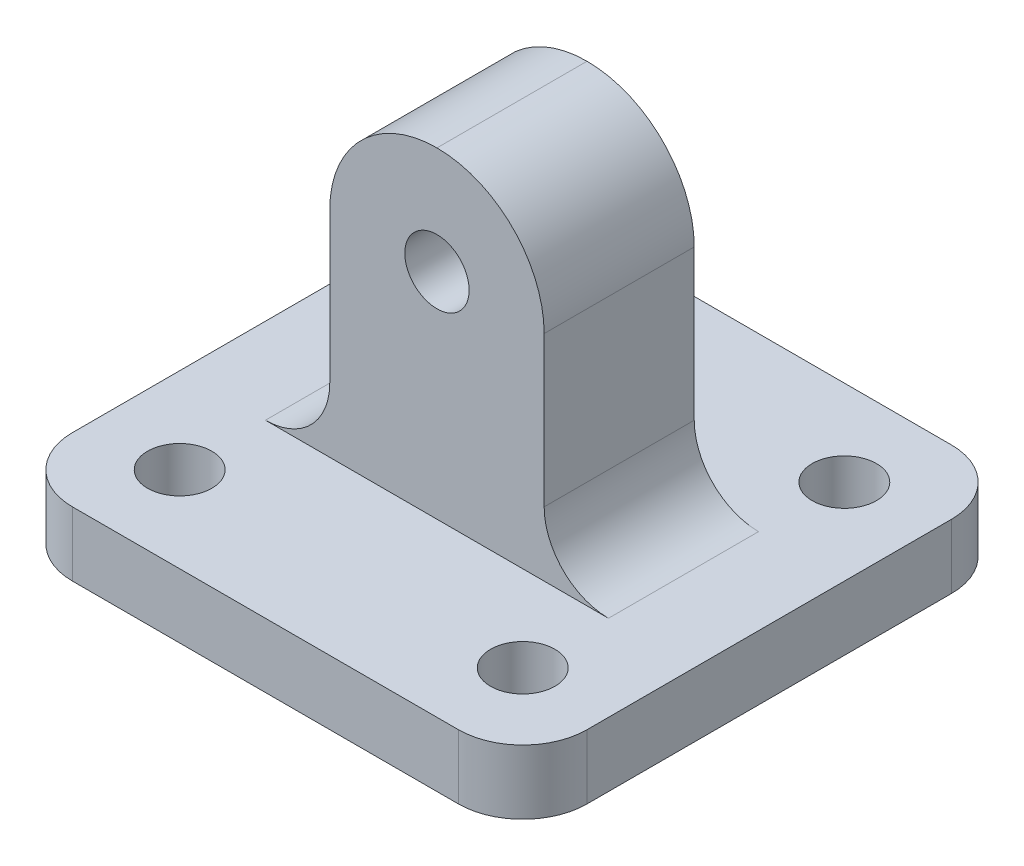
ISO-10303-21;
HEADER;
FILE_DESCRIPTION(('STEP AP214'),'2;1');
FILE_NAME('part.step','',(''),(''),'','','');
FILE_SCHEMA(('AUTOMOTIVE_DESIGN { 1 0 10303 214 1 1 1 1 }'));
ENDSEC;
DATA;
#1=APPLICATION_CONTEXT('core data for automotive mechanical design processes');
#2=APPLICATION_PROTOCOL_DEFINITION('international standard','automotive_design',2000,#1);
#3=PRODUCT_CONTEXT('',#1,'mechanical');
#4=PRODUCT('Part','Part','',(#3));
#5=PRODUCT_RELATED_PRODUCT_CATEGORY('part','',(#4));
#6=PRODUCT_DEFINITION_FORMATION('','',#4);
#7=PRODUCT_DEFINITION_CONTEXT('part definition',#1,'design');
#8=PRODUCT_DEFINITION('design','',#6,#7);
#9=PRODUCT_DEFINITION_SHAPE('','',#8);
#10=(LENGTH_UNIT() NAMED_UNIT(*) SI_UNIT(.MILLI.,.METRE.));
#11=(NAMED_UNIT(*) PLANE_ANGLE_UNIT() SI_UNIT($,.RADIAN.));
#12=(NAMED_UNIT(*) SI_UNIT($,.STERADIAN.) SOLID_ANGLE_UNIT());
#13=UNCERTAINTY_MEASURE_WITH_UNIT(LENGTH_MEASURE(1.E-05),#10,'distance_accuracy_value','');
#14=(GEOMETRIC_REPRESENTATION_CONTEXT(3) GLOBAL_UNCERTAINTY_ASSIGNED_CONTEXT((#13)) GLOBAL_UNIT_ASSIGNED_CONTEXT((#10,
#11,#12)) REPRESENTATION_CONTEXT('',''));
#15=CARTESIAN_POINT('',(0.,0.,0.));
#16=DIRECTION('',(0.,0.,1.));
#17=DIRECTION('',(1.,0.,0.));
#18=AXIS2_PLACEMENT_3D('',#15,#16,#17);
#19=CARTESIAN_POINT('',(0.,3.,0.));
#20=DIRECTION('',(0.,-1.,0.));
#21=DIRECTION('',(0.,0.,-1.));
#22=AXIS2_PLACEMENT_3D('',#19,#20,#21);
#23=PLANE('',#22);
#24=CARTESIAN_POINT('',(8.,3.,-7.5));
#25=DIRECTION('',(0.,1.,0.));
#26=DIRECTION('',(0.,0.,1.));
#27=AXIS2_PLACEMENT_3D('',#24,#25,#26);
#28=CIRCLE('',#27,1.5);
#29=CARTESIAN_POINT('',(8.,3.,-6.));
#30=VERTEX_POINT('',#29);
#31=EDGE_CURVE('E187',#30,#30,#28,.T.);
#32=ORIENTED_EDGE('',*,*,#31,.F.);
#33=EDGE_LOOP('',(#32));
#34=FACE_BOUND('',#33,.T.);
#35=CARTESIAN_POINT('',(8.,3.,7.5));
#36=DIRECTION('',(0.,1.,0.));
#37=DIRECTION('',(0.,0.,1.));
#38=AXIS2_PLACEMENT_3D('',#35,#36,#37);
#39=CIRCLE('',#38,1.5);
#40=CARTESIAN_POINT('',(8.,3.,9.));
#41=VERTEX_POINT('',#40);
#42=EDGE_CURVE('E291',#41,#41,#39,.T.);
#43=ORIENTED_EDGE('',*,*,#42,.F.);
#44=EDGE_LOOP('',(#43));
#45=FACE_BOUND('',#44,.T.);
#46=CARTESIAN_POINT('',(-8.,3.,7.5));
#47=DIRECTION('',(0.,1.,0.));
#48=DIRECTION('',(0.,0.,1.));
#49=AXIS2_PLACEMENT_3D('',#46,#47,#48);
#50=CIRCLE('',#49,1.5);
#51=CARTESIAN_POINT('',(-8.,3.,9.));
#52=VERTEX_POINT('',#51);
#53=EDGE_CURVE('E297',#52,#52,#50,.T.);
#54=ORIENTED_EDGE('',*,*,#53,.F.);
#55=EDGE_LOOP('',(#54));
#56=FACE_BOUND('',#55,.T.);
#57=CARTESIAN_POINT('',(-8.,3.,-7.5));
#58=DIRECTION('',(0.,1.,0.));
#59=DIRECTION('',(0.,0.,1.));
#60=AXIS2_PLACEMENT_3D('',#57,#58,#59);
#61=CIRCLE('',#60,1.5);
#62=CARTESIAN_POINT('',(-8.,3.,-6.));
#63=VERTEX_POINT('',#62);
#64=EDGE_CURVE('E280',#63,#63,#61,.T.);
#65=ORIENTED_EDGE('',*,*,#64,.F.);
#66=EDGE_LOOP('',(#65));
#67=FACE_BOUND('',#66,.T.);
#68=DIRECTION('',(0.,0.,-1.));
#69=VECTOR('',#68,1.);
#70=CARTESIAN_POINT('',(12.,3.,11.5));
#71=LINE('',#70,#69);
#72=CARTESIAN_POINT('',(12.,3.,8.5));
#73=VERTEX_POINT('',#72);
#74=CARTESIAN_POINT('',(12.,3.,-8.5));
#75=VERTEX_POINT('',#74);
#76=EDGE_CURVE('E252',#73,#75,#71,.T.);
#77=ORIENTED_EDGE('',*,*,#76,.T.);
#78=CARTESIAN_POINT('',(9.,3.,-8.5));
#79=DIRECTION('',(0.,-1.,0.));
#80=DIRECTION('',(0.,0.,-1.));
#81=AXIS2_PLACEMENT_3D('',#78,#79,#80);
#82=CIRCLE('',#81,3.);
#83=CARTESIAN_POINT('',(9.,3.,-11.5));
#84=VERTEX_POINT('',#83);
#85=EDGE_CURVE('E230',#75,#84,#82,.F.);
#86=ORIENTED_EDGE('',*,*,#85,.T.);
#87=DIRECTION('',(-1.,0.,0.));
#88=VECTOR('',#87,1.);
#89=CARTESIAN_POINT('',(-12.,3.,-11.5));
#90=LINE('',#89,#88);
#91=CARTESIAN_POINT('',(-9.,3.,-11.5));
#92=VERTEX_POINT('',#91);
#93=EDGE_CURVE('E259',#84,#92,#90,.T.);
#94=ORIENTED_EDGE('',*,*,#93,.T.);
#95=CARTESIAN_POINT('',(-9.,3.,-8.5));
#96=DIRECTION('',(0.,-1.,0.));
#97=DIRECTION('',(0.,0.,-1.));
#98=AXIS2_PLACEMENT_3D('',#95,#96,#97);
#99=CIRCLE('',#98,3.);
#100=CARTESIAN_POINT('',(-12.,3.,-8.5));
#101=VERTEX_POINT('',#100);
#102=EDGE_CURVE('E225',#92,#101,#99,.F.);
#103=ORIENTED_EDGE('',*,*,#102,.T.);
#104=DIRECTION('',(0.,0.,1.));
#105=VECTOR('',#104,1.);
#106=CARTESIAN_POINT('',(-12.,3.,11.5));
#107=LINE('',#106,#105);
#108=CARTESIAN_POINT('',(-12.,3.,8.5));
#109=VERTEX_POINT('',#108);
#110=EDGE_CURVE('E175',#101,#109,#107,.T.);
#111=ORIENTED_EDGE('',*,*,#110,.T.);
#112=CARTESIAN_POINT('',(-9.,3.,8.5));
#113=DIRECTION('',(0.,-1.,0.));
#114=DIRECTION('',(0.,0.,-1.));
#115=AXIS2_PLACEMENT_3D('',#112,#113,#114);
#116=CIRCLE('',#115,3.);
#117=CARTESIAN_POINT('',(-9.,3.,11.5));
#118=VERTEX_POINT('',#117);
#119=EDGE_CURVE('E56',#109,#118,#116,.F.);
#120=ORIENTED_EDGE('',*,*,#119,.T.);
#121=DIRECTION('',(1.,0.,0.));
#122=VECTOR('',#121,1.);
#123=CARTESIAN_POINT('',(-12.,3.,11.5));
#124=LINE('',#123,#122);
#125=CARTESIAN_POINT('',(9.,3.,11.5));
#126=VERTEX_POINT('',#125);
#127=EDGE_CURVE('E171',#118,#126,#124,.T.);
#128=ORIENTED_EDGE('',*,*,#127,.T.);
#129=CARTESIAN_POINT('',(9.,3.,8.5));
#130=DIRECTION('',(0.,-1.,0.));
#131=DIRECTION('',(0.,0.,-1.));
#132=AXIS2_PLACEMENT_3D('',#129,#130,#131);
#133=CIRCLE('',#132,3.);
#134=EDGE_CURVE('E228',#126,#73,#133,.F.);
#135=ORIENTED_EDGE('',*,*,#134,.T.);
#136=EDGE_LOOP('',(#77,#86,#94,#103,#111,#120,#128,#135));
#137=FACE_BOUND('',#136,.T.);
#138=DIRECTION('',(-1.,0.,0.));
#139=VECTOR('',#138,1.);
#140=CARTESIAN_POINT('',(-5.,3.,-3.5));
#141=LINE('',#140,#139);
#142=CARTESIAN_POINT('',(8.,3.,-3.5));
#143=VERTEX_POINT('',#142);
#144=CARTESIAN_POINT('',(-8.,3.,-3.5));
#145=VERTEX_POINT('',#144);
#146=EDGE_CURVE('E271',#143,#145,#141,.T.);
#147=ORIENTED_EDGE('',*,*,#146,.F.);
#148=DIRECTION('',(0.,0.,-1.));
#149=VECTOR('',#148,1.);
#150=CARTESIAN_POINT('',(8.,3.,3.5));
#151=LINE('',#150,#149);
#152=CARTESIAN_POINT('',(8.,3.,3.5));
#153=VERTEX_POINT('',#152);
#154=EDGE_CURVE('E192',#143,#153,#151,.F.);
#155=ORIENTED_EDGE('',*,*,#154,.T.);
#156=DIRECTION('',(1.,0.,0.));
#157=VECTOR('',#156,1.);
#158=CARTESIAN_POINT('',(-5.,3.,3.5));
#159=LINE('',#158,#157);
#160=CARTESIAN_POINT('',(-8.,3.,3.5));
#161=VERTEX_POINT('',#160);
#162=EDGE_CURVE('E164',#161,#153,#159,.T.);
#163=ORIENTED_EDGE('',*,*,#162,.F.);
#164=DIRECTION('',(0.,0.,1.));
#165=VECTOR('',#164,1.);
#166=CARTESIAN_POINT('',(-8.,3.,-3.5));
#167=LINE('',#166,#165);
#168=EDGE_CURVE('E189',#161,#145,#167,.F.);
#169=ORIENTED_EDGE('',*,*,#168,.T.);
#170=EDGE_LOOP('',(#147,#155,#163,#169));
#171=FACE_BOUND('',#170,.T.);
#172=ADVANCED_FACE('F34',(#34,#45,#56,#67,#137,#171),#23,.F.);
#173=CARTESIAN_POINT('',(12.,3.,11.5));
#174=DIRECTION('',(-1.,0.,0.));
#175=DIRECTION('',(0.,0.,1.));
#176=AXIS2_PLACEMENT_3D('',#173,#174,#175);
#177=PLANE('',#176);
#178=DIRECTION('',(0.,0.,-1.));
#179=VECTOR('',#178,1.);
#180=CARTESIAN_POINT('',(12.,0.,11.5));
#181=LINE('',#180,#179);
#182=CARTESIAN_POINT('',(12.,0.,8.5));
#183=VERTEX_POINT('',#182);
#184=CARTESIAN_POINT('',(12.,0.,-8.5));
#185=VERTEX_POINT('',#184);
#186=EDGE_CURVE('E253',#183,#185,#181,.T.);
#187=ORIENTED_EDGE('',*,*,#186,.T.);
#188=DIRECTION('',(0.,-1.,0.));
#189=VECTOR('',#188,1.);
#190=CARTESIAN_POINT('',(12.,3.,-8.5));
#191=LINE('',#190,#189);
#192=EDGE_CURVE('E223',#185,#75,#191,.F.);
#193=ORIENTED_EDGE('',*,*,#192,.T.);
#194=ORIENTED_EDGE('',*,*,#76,.F.);
#195=DIRECTION('',(0.,-1.,0.));
#196=VECTOR('',#195,1.);
#197=CARTESIAN_POINT('',(12.,3.,8.5));
#198=LINE('',#197,#196);
#199=EDGE_CURVE('E220',#73,#183,#198,.T.);
#200=ORIENTED_EDGE('',*,*,#199,.T.);
#201=EDGE_LOOP('',(#187,#193,#194,#200));
#202=FACE_BOUND('',#201,.T.);
#203=ADVANCED_FACE('F315',(#202),#177,.F.);
#204=CARTESIAN_POINT('',(-12.,3.,-11.5));
#205=DIRECTION('',(0.,0.,1.));
#206=DIRECTION('',(1.,0.,0.));
#207=AXIS2_PLACEMENT_3D('',#204,#205,#206);
#208=PLANE('',#207);
#209=ORIENTED_EDGE('',*,*,#93,.F.);
#210=DIRECTION('',(0.,-1.,0.));
#211=VECTOR('',#210,1.);
#212=CARTESIAN_POINT('',(9.,3.,-11.5));
#213=LINE('',#212,#211);
#214=CARTESIAN_POINT('',(9.,0.,-11.5));
#215=VERTEX_POINT('',#214);
#216=EDGE_CURVE('E209',#84,#215,#213,.T.);
#217=ORIENTED_EDGE('',*,*,#216,.T.);
#218=DIRECTION('',(-1.,0.,0.));
#219=VECTOR('',#218,1.);
#220=CARTESIAN_POINT('',(-12.,0.,-11.5));
#221=LINE('',#220,#219);
#222=CARTESIAN_POINT('',(-9.,0.,-11.5));
#223=VERTEX_POINT('',#222);
#224=EDGE_CURVE('E251',#215,#223,#221,.T.);
#225=ORIENTED_EDGE('',*,*,#224,.T.);
#226=DIRECTION('',(0.,-1.,0.));
#227=VECTOR('',#226,1.);
#228=CARTESIAN_POINT('',(-9.,3.,-11.5));
#229=LINE('',#228,#227);
#230=EDGE_CURVE('E207',#223,#92,#229,.F.);
#231=ORIENTED_EDGE('',*,*,#230,.T.);
#232=EDGE_LOOP('',(#209,#217,#225,#231));
#233=FACE_BOUND('',#232,.T.);
#234=ADVANCED_FACE('F367',(#233),#208,.F.);
#235=CARTESIAN_POINT('',(-12.,3.,11.5));
#236=DIRECTION('',(1.,0.,0.));
#237=DIRECTION('',(0.,0.,-1.));
#238=AXIS2_PLACEMENT_3D('',#235,#236,#237);
#239=PLANE('',#238);
#240=DIRECTION('',(0.,0.,1.));
#241=VECTOR('',#240,1.);
#242=CARTESIAN_POINT('',(-12.,0.,11.5));
#243=LINE('',#242,#241);
#244=CARTESIAN_POINT('',(-12.,0.,-8.5));
#245=VERTEX_POINT('',#244);
#246=CARTESIAN_POINT('',(-12.,0.,8.5));
#247=VERTEX_POINT('',#246);
#248=EDGE_CURVE('E242',#245,#247,#243,.T.);
#249=ORIENTED_EDGE('',*,*,#248,.T.);
#250=DIRECTION('',(0.,-1.,0.));
#251=VECTOR('',#250,1.);
#252=CARTESIAN_POINT('',(-12.,3.,8.5));
#253=LINE('',#252,#251);
#254=EDGE_CURVE('E11',#247,#109,#253,.F.);
#255=ORIENTED_EDGE('',*,*,#254,.T.);
#256=ORIENTED_EDGE('',*,*,#110,.F.);
#257=DIRECTION('',(0.,-1.,0.));
#258=VECTOR('',#257,1.);
#259=CARTESIAN_POINT('',(-12.,3.,-8.5));
#260=LINE('',#259,#258);
#261=EDGE_CURVE('E42',#101,#245,#260,.T.);
#262=ORIENTED_EDGE('',*,*,#261,.T.);
#263=EDGE_LOOP('',(#249,#255,#256,#262));
#264=FACE_BOUND('',#263,.T.);
#265=ADVANCED_FACE('F241',(#264),#239,.F.);
#266=CARTESIAN_POINT('',(-12.,3.,11.5));
#267=DIRECTION('',(0.,0.,-1.));
#268=DIRECTION('',(-1.,0.,0.));
#269=AXIS2_PLACEMENT_3D('',#266,#267,#268);
#270=PLANE('',#269);
#271=DIRECTION('',(1.,0.,0.));
#272=VECTOR('',#271,1.);
#273=CARTESIAN_POINT('',(-12.,0.,11.5));
#274=LINE('',#273,#272);
#275=CARTESIAN_POINT('',(-9.,0.,11.5));
#276=VERTEX_POINT('',#275);
#277=CARTESIAN_POINT('',(9.,0.,11.5));
#278=VERTEX_POINT('',#277);
#279=EDGE_CURVE('E178',#276,#278,#274,.T.);
#280=ORIENTED_EDGE('',*,*,#279,.T.);
#281=DIRECTION('',(0.,-1.,0.));
#282=VECTOR('',#281,1.);
#283=CARTESIAN_POINT('',(9.,3.,11.5));
#284=LINE('',#283,#282);
#285=EDGE_CURVE('E49',#278,#126,#284,.F.);
#286=ORIENTED_EDGE('',*,*,#285,.T.);
#287=ORIENTED_EDGE('',*,*,#127,.F.);
#288=DIRECTION('',(0.,-1.,0.));
#289=VECTOR('',#288,1.);
#290=CARTESIAN_POINT('',(-9.,3.,11.5));
#291=LINE('',#290,#289);
#292=EDGE_CURVE('E232',#118,#276,#291,.T.);
#293=ORIENTED_EDGE('',*,*,#292,.T.);
#294=EDGE_LOOP('',(#280,#286,#287,#293));
#295=FACE_BOUND('',#294,.T.);
#296=ADVANCED_FACE('F358',(#295),#270,.F.);
#297=CARTESIAN_POINT('',(0.,0.,0.));
#298=DIRECTION('',(0.,-1.,0.));
#299=DIRECTION('',(0.,0.,-1.));
#300=AXIS2_PLACEMENT_3D('',#297,#298,#299);
#301=PLANE('',#300);
#302=CARTESIAN_POINT('',(8.,0.,-7.5));
#303=DIRECTION('',(0.,1.,0.));
#304=DIRECTION('',(0.,0.,1.));
#305=AXIS2_PLACEMENT_3D('',#302,#303,#304);
#306=CIRCLE('',#305,1.5);
#307=CARTESIAN_POINT('',(8.,0.,-6.));
#308=VERTEX_POINT('',#307);
#309=EDGE_CURVE('E288',#308,#308,#306,.T.);
#310=ORIENTED_EDGE('',*,*,#309,.T.);
#311=EDGE_LOOP('',(#310));
#312=FACE_BOUND('',#311,.T.);
#313=CARTESIAN_POINT('',(8.,0.,7.5));
#314=DIRECTION('',(0.,1.,0.));
#315=DIRECTION('',(0.,0.,1.));
#316=AXIS2_PLACEMENT_3D('',#313,#314,#315);
#317=CIRCLE('',#316,1.5);
#318=CARTESIAN_POINT('',(8.,0.,9.));
#319=VERTEX_POINT('',#318);
#320=EDGE_CURVE('E294',#319,#319,#317,.T.);
#321=ORIENTED_EDGE('',*,*,#320,.T.);
#322=EDGE_LOOP('',(#321));
#323=FACE_BOUND('',#322,.T.);
#324=CARTESIAN_POINT('',(-8.,0.,7.5));
#325=DIRECTION('',(0.,1.,0.));
#326=DIRECTION('',(0.,0.,1.));
#327=AXIS2_PLACEMENT_3D('',#324,#325,#326);
#328=CIRCLE('',#327,1.5);
#329=CARTESIAN_POINT('',(-8.,0.,9.));
#330=VERTEX_POINT('',#329);
#331=EDGE_CURVE('E283',#330,#330,#328,.T.);
#332=ORIENTED_EDGE('',*,*,#331,.T.);
#333=EDGE_LOOP('',(#332));
#334=FACE_BOUND('',#333,.T.);
#335=CARTESIAN_POINT('',(-8.,0.,-7.5));
#336=DIRECTION('',(0.,1.,0.));
#337=DIRECTION('',(0.,0.,1.));
#338=AXIS2_PLACEMENT_3D('',#335,#336,#337);
#339=CIRCLE('',#338,1.5);
#340=CARTESIAN_POINT('',(-8.,0.,-6.));
#341=VERTEX_POINT('',#340);
#342=EDGE_CURVE('E279',#341,#341,#339,.T.);
#343=ORIENTED_EDGE('',*,*,#342,.T.);
#344=EDGE_LOOP('',(#343));
#345=FACE_BOUND('',#344,.T.);
#346=ORIENTED_EDGE('',*,*,#224,.F.);
#347=CARTESIAN_POINT('',(9.,0.,-8.5));
#348=DIRECTION('',(0.,-1.,0.));
#349=DIRECTION('',(0.,0.,-1.));
#350=AXIS2_PLACEMENT_3D('',#347,#348,#349);
#351=CIRCLE('',#350,3.);
#352=EDGE_CURVE('E218',#215,#185,#351,.T.);
#353=ORIENTED_EDGE('',*,*,#352,.T.);
#354=ORIENTED_EDGE('',*,*,#186,.F.);
#355=CARTESIAN_POINT('',(9.,0.,8.5));
#356=DIRECTION('',(0.,-1.,0.));
#357=DIRECTION('',(0.,0.,-1.));
#358=AXIS2_PLACEMENT_3D('',#355,#356,#357);
#359=CIRCLE('',#358,3.);
#360=EDGE_CURVE('E216',#183,#278,#359,.T.);
#361=ORIENTED_EDGE('',*,*,#360,.T.);
#362=ORIENTED_EDGE('',*,*,#279,.F.);
#363=CARTESIAN_POINT('',(-9.,0.,8.5));
#364=DIRECTION('',(0.,-1.,0.));
#365=DIRECTION('',(0.,0.,-1.));
#366=AXIS2_PLACEMENT_3D('',#363,#364,#365);
#367=CIRCLE('',#366,3.);
#368=EDGE_CURVE('E214',#276,#247,#367,.T.);
#369=ORIENTED_EDGE('',*,*,#368,.T.);
#370=ORIENTED_EDGE('',*,*,#248,.F.);
#371=CARTESIAN_POINT('',(-9.,0.,-8.5));
#372=DIRECTION('',(0.,-1.,0.));
#373=DIRECTION('',(0.,0.,-1.));
#374=AXIS2_PLACEMENT_3D('',#371,#372,#373);
#375=CIRCLE('',#374,3.);
#376=EDGE_CURVE('E212',#245,#223,#375,.T.);
#377=ORIENTED_EDGE('',*,*,#376,.T.);
#378=EDGE_LOOP('',(#346,#353,#354,#361,#362,#369,#370,#377));
#379=FACE_BOUND('',#378,.T.);
#380=ADVANCED_FACE('F248',(#312,#323,#334,#345,#379),#301,.T.);
#381=CARTESIAN_POINT('',(5.,18.,3.5));
#382=DIRECTION('',(-1.,0.,0.));
#383=DIRECTION('',(0.,0.,1.));
#384=AXIS2_PLACEMENT_3D('',#381,#382,#383);
#385=PLANE('',#384);
#386=DIRECTION('',(0.,-1.,0.));
#387=VECTOR('',#386,1.);
#388=CARTESIAN_POINT('',(5.,18.,3.5));
#389=LINE('',#388,#387);
#390=CARTESIAN_POINT('',(5.,13.,3.5));
#391=VERTEX_POINT('',#390);
#392=CARTESIAN_POINT('',(5.,6.,3.5));
#393=VERTEX_POINT('',#392);
#394=EDGE_CURVE('E147',#391,#393,#389,.T.);
#395=ORIENTED_EDGE('',*,*,#394,.T.);
#396=DIRECTION('',(0.,0.,-1.));
#397=VECTOR('',#396,1.);
#398=CARTESIAN_POINT('',(5.,6.,-3.5));
#399=LINE('',#398,#397);
#400=CARTESIAN_POINT('',(5.,6.,-3.5));
#401=VERTEX_POINT('',#400);
#402=EDGE_CURVE('E154',#393,#401,#399,.T.);
#403=ORIENTED_EDGE('',*,*,#402,.T.);
#404=DIRECTION('',(0.,-1.,0.));
#405=VECTOR('',#404,1.);
#406=CARTESIAN_POINT('',(5.,18.,-3.5));
#407=LINE('',#406,#405);
#408=CARTESIAN_POINT('',(5.,13.,-3.5));
#409=VERTEX_POINT('',#408);
#410=EDGE_CURVE('E150',#409,#401,#407,.T.);
#411=ORIENTED_EDGE('',*,*,#410,.F.);
#412=DIRECTION('',(0.,0.,-1.));
#413=VECTOR('',#412,1.);
#414=CARTESIAN_POINT('',(5.,13.,3.5));
#415=LINE('',#414,#413);
#416=EDGE_CURVE('E143',#409,#391,#415,.F.);
#417=ORIENTED_EDGE('',*,*,#416,.T.);
#418=EDGE_LOOP('',(#395,#403,#411,#417));
#419=FACE_BOUND('',#418,.T.);
#420=ADVANCED_FACE('F145',(#419),#385,.F.);
#421=CARTESIAN_POINT('',(-5.,18.,-3.5));
#422=DIRECTION('',(0.,0.,1.));
#423=DIRECTION('',(1.,0.,0.));
#424=AXIS2_PLACEMENT_3D('',#421,#422,#423);
#425=PLANE('',#424);
#426=CARTESIAN_POINT('',(0.,13.,-3.5));
#427=DIRECTION('',(0.,0.,1.));
#428=DIRECTION('',(1.,0.,0.));
#429=AXIS2_PLACEMENT_3D('',#426,#427,#428);
#430=CIRCLE('',#429,1.5);
#431=CARTESIAN_POINT('',(1.5,13.,-3.5));
#432=VERTEX_POINT('',#431);
#433=EDGE_CURVE('E273',#432,#432,#430,.T.);
#434=ORIENTED_EDGE('',*,*,#433,.T.);
#435=EDGE_LOOP('',(#434));
#436=FACE_BOUND('',#435,.T.);
#437=DIRECTION('',(0.,-1.,0.));
#438=VECTOR('',#437,1.);
#439=CARTESIAN_POINT('',(-5.,18.,-3.5));
#440=LINE('',#439,#438);
#441=CARTESIAN_POINT('',(-5.,13.,-3.5));
#442=VERTEX_POINT('',#441);
#443=CARTESIAN_POINT('',(-5.,6.,-3.5));
#444=VERTEX_POINT('',#443);
#445=EDGE_CURVE('E265',#442,#444,#440,.T.);
#446=ORIENTED_EDGE('',*,*,#445,.F.);
#447=CARTESIAN_POINT('',(0.,13.,-3.5));
#448=DIRECTION('',(0.,0.,1.));
#449=DIRECTION('',(1.,0.,0.));
#450=AXIS2_PLACEMENT_3D('',#447,#448,#449);
#451=CIRCLE('',#450,5.);
#452=CARTESIAN_POINT('',(0.,18.,-3.5));
#453=VERTEX_POINT('',#452);
#454=EDGE_CURVE('E155',#442,#453,#451,.F.);
#455=ORIENTED_EDGE('',*,*,#454,.T.);
#456=CARTESIAN_POINT('',(0.,13.,-3.5));
#457=DIRECTION('',(0.,0.,1.));
#458=DIRECTION('',(1.,0.,0.));
#459=AXIS2_PLACEMENT_3D('',#456,#457,#458);
#460=CIRCLE('',#459,5.);
#461=EDGE_CURVE('E183',#453,#409,#460,.F.);
#462=ORIENTED_EDGE('',*,*,#461,.T.);
#463=ORIENTED_EDGE('',*,*,#410,.T.);
#464=CARTESIAN_POINT('',(8.,6.,-3.5));
#465=DIRECTION('',(0.,0.,1.));
#466=DIRECTION('',(1.,0.,0.));
#467=AXIS2_PLACEMENT_3D('',#464,#465,#466);
#468=CIRCLE('',#467,3.);
#469=EDGE_CURVE('E198',#401,#143,#468,.T.);
#470=ORIENTED_EDGE('',*,*,#469,.T.);
#471=ORIENTED_EDGE('',*,*,#146,.T.);
#472=CARTESIAN_POINT('',(-8.,6.,-3.5));
#473=DIRECTION('',(0.,0.,1.));
#474=DIRECTION('',(1.,0.,0.));
#475=AXIS2_PLACEMENT_3D('',#472,#473,#474);
#476=CIRCLE('',#475,3.);
#477=EDGE_CURVE('E205',#145,#444,#476,.T.);
#478=ORIENTED_EDGE('',*,*,#477,.T.);
#479=EDGE_LOOP('',(#446,#455,#462,#463,#470,#471,#478));
#480=FACE_BOUND('',#479,.T.);
#481=ADVANCED_FACE('F327',(#436,#480),#425,.F.);
#482=CARTESIAN_POINT('',(-5.,18.,3.5));
#483=DIRECTION('',(1.,0.,0.));
#484=DIRECTION('',(0.,0.,-1.));
#485=AXIS2_PLACEMENT_3D('',#482,#483,#484);
#486=PLANE('',#485);
#487=ORIENTED_EDGE('',*,*,#445,.T.);
#488=DIRECTION('',(0.,0.,1.));
#489=VECTOR('',#488,1.);
#490=CARTESIAN_POINT('',(-5.,6.,3.5));
#491=LINE('',#490,#489);
#492=CARTESIAN_POINT('',(-5.,6.,3.5));
#493=VERTEX_POINT('',#492);
#494=EDGE_CURVE('E195',#444,#493,#491,.T.);
#495=ORIENTED_EDGE('',*,*,#494,.T.);
#496=DIRECTION('',(0.,-1.,0.));
#497=VECTOR('',#496,1.);
#498=CARTESIAN_POINT('',(-5.,18.,3.5));
#499=LINE('',#498,#497);
#500=CARTESIAN_POINT('',(-5.,13.,3.5));
#501=VERTEX_POINT('',#500);
#502=EDGE_CURVE('E163',#501,#493,#499,.T.);
#503=ORIENTED_EDGE('',*,*,#502,.F.);
#504=DIRECTION('',(0.,0.,1.));
#505=VECTOR('',#504,1.);
#506=CARTESIAN_POINT('',(-5.,13.,3.5));
#507=LINE('',#506,#505);
#508=EDGE_CURVE('E173',#501,#442,#507,.F.);
#509=ORIENTED_EDGE('',*,*,#508,.T.);
#510=EDGE_LOOP('',(#487,#495,#503,#509));
#511=FACE_BOUND('',#510,.T.);
#512=ADVANCED_FACE('F387',(#511),#486,.F.);
#513=CARTESIAN_POINT('',(-5.,18.,3.5));
#514=DIRECTION('',(0.,0.,-1.));
#515=DIRECTION('',(-1.,0.,0.));
#516=AXIS2_PLACEMENT_3D('',#513,#514,#515);
#517=PLANE('',#516);
#518=CARTESIAN_POINT('',(0.,13.,3.5));
#519=DIRECTION('',(0.,0.,1.));
#520=DIRECTION('',(1.,0.,0.));
#521=AXIS2_PLACEMENT_3D('',#518,#519,#520);
#522=CIRCLE('',#521,1.5);
#523=CARTESIAN_POINT('',(1.5,13.,3.5));
#524=VERTEX_POINT('',#523);
#525=EDGE_CURVE('E276',#524,#524,#522,.T.);
#526=ORIENTED_EDGE('',*,*,#525,.F.);
#527=EDGE_LOOP('',(#526));
#528=FACE_BOUND('',#527,.T.);
#529=CARTESIAN_POINT('',(0.,13.,3.5));
#530=DIRECTION('',(0.,0.,-1.));
#531=DIRECTION('',(-1.,0.,0.));
#532=AXIS2_PLACEMENT_3D('',#529,#530,#531);
#533=CIRCLE('',#532,5.);
#534=CARTESIAN_POINT('',(0.,18.,3.5));
#535=VERTEX_POINT('',#534);
#536=EDGE_CURVE('E159',#391,#535,#533,.F.);
#537=ORIENTED_EDGE('',*,*,#536,.T.);
#538=CARTESIAN_POINT('',(0.,13.,3.5));
#539=DIRECTION('',(0.,0.,-1.));
#540=DIRECTION('',(-1.,0.,0.));
#541=AXIS2_PLACEMENT_3D('',#538,#539,#540);
#542=CIRCLE('',#541,5.);
#543=EDGE_CURVE('E170',#535,#501,#542,.F.);
#544=ORIENTED_EDGE('',*,*,#543,.T.);
#545=ORIENTED_EDGE('',*,*,#502,.T.);
#546=CARTESIAN_POINT('',(-8.,6.,3.5));
#547=DIRECTION('',(0.,0.,-1.));
#548=DIRECTION('',(-1.,0.,0.));
#549=AXIS2_PLACEMENT_3D('',#546,#547,#548);
#550=CIRCLE('',#549,3.);
#551=EDGE_CURVE('E202',#493,#161,#550,.T.);
#552=ORIENTED_EDGE('',*,*,#551,.T.);
#553=ORIENTED_EDGE('',*,*,#162,.T.);
#554=CARTESIAN_POINT('',(8.,6.,3.5));
#555=DIRECTION('',(0.,0.,-1.));
#556=DIRECTION('',(-1.,0.,0.));
#557=AXIS2_PLACEMENT_3D('',#554,#555,#556);
#558=CIRCLE('',#557,3.);
#559=EDGE_CURVE('E162',#153,#393,#558,.T.);
#560=ORIENTED_EDGE('',*,*,#559,.T.);
#561=ORIENTED_EDGE('',*,*,#394,.F.);
#562=EDGE_LOOP('',(#537,#544,#545,#552,#553,#560,#561));
#563=FACE_BOUND('',#562,.T.);
#564=ADVANCED_FACE('F158',(#528,#563),#517,.F.);
#565=CARTESIAN_POINT('',(0.,13.,-11.5));
#566=DIRECTION('',(0.,0.,1.));
#567=DIRECTION('',(1.,0.,0.));
#568=AXIS2_PLACEMENT_3D('',#565,#566,#567);
#569=CYLINDRICAL_SURFACE('',#568,1.5);
#570=ORIENTED_EDGE('',*,*,#525,.T.);
#571=EDGE_LOOP('',(#570));
#572=FACE_BOUND('',#571,.T.);
#573=ORIENTED_EDGE('',*,*,#433,.F.);
#574=EDGE_LOOP('',(#573));
#575=FACE_BOUND('',#574,.T.);
#576=ADVANCED_FACE('F394',(#572,#575),#569,.F.);
#577=CARTESIAN_POINT('',(-8.,0.,-7.5));
#578=DIRECTION('',(0.,1.,0.));
#579=DIRECTION('',(0.,0.,1.));
#580=AXIS2_PLACEMENT_3D('',#577,#578,#579);
#581=CYLINDRICAL_SURFACE('',#580,1.5);
#582=ORIENTED_EDGE('',*,*,#342,.F.);
#583=EDGE_LOOP('',(#582));
#584=FACE_BOUND('',#583,.T.);
#585=ORIENTED_EDGE('',*,*,#64,.T.);
#586=EDGE_LOOP('',(#585));
#587=FACE_BOUND('',#586,.T.);
#588=ADVANCED_FACE('F309',(#584,#587),#581,.F.);
#589=CARTESIAN_POINT('',(-8.,0.,7.5));
#590=DIRECTION('',(0.,1.,0.));
#591=DIRECTION('',(0.,0.,1.));
#592=AXIS2_PLACEMENT_3D('',#589,#590,#591);
#593=CYLINDRICAL_SURFACE('',#592,1.5);
#594=ORIENTED_EDGE('',*,*,#331,.F.);
#595=EDGE_LOOP('',(#594));
#596=FACE_BOUND('',#595,.T.);
#597=ORIENTED_EDGE('',*,*,#53,.T.);
#598=EDGE_LOOP('',(#597));
#599=FACE_BOUND('',#598,.T.);
#600=ADVANCED_FACE('F305',(#596,#599),#593,.F.);
#601=CARTESIAN_POINT('',(8.,0.,7.5));
#602=DIRECTION('',(0.,1.,0.));
#603=DIRECTION('',(0.,0.,1.));
#604=AXIS2_PLACEMENT_3D('',#601,#602,#603);
#605=CYLINDRICAL_SURFACE('',#604,1.5);
#606=ORIENTED_EDGE('',*,*,#320,.F.);
#607=EDGE_LOOP('',(#606));
#608=FACE_BOUND('',#607,.T.);
#609=ORIENTED_EDGE('',*,*,#42,.T.);
#610=EDGE_LOOP('',(#609));
#611=FACE_BOUND('',#610,.T.);
#612=ADVANCED_FACE('F308',(#608,#611),#605,.F.);
#613=CARTESIAN_POINT('',(8.,0.,-7.5));
#614=DIRECTION('',(0.,1.,0.));
#615=DIRECTION('',(0.,0.,1.));
#616=AXIS2_PLACEMENT_3D('',#613,#614,#615);
#617=CYLINDRICAL_SURFACE('',#616,1.5);
#618=ORIENTED_EDGE('',*,*,#309,.F.);
#619=EDGE_LOOP('',(#618));
#620=FACE_BOUND('',#619,.T.);
#621=ORIENTED_EDGE('',*,*,#31,.T.);
#622=EDGE_LOOP('',(#621));
#623=FACE_BOUND('',#622,.T.);
#624=ADVANCED_FACE('F402',(#620,#623),#617,.F.);
#625=CARTESIAN_POINT('',(0.,13.,0.));
#626=DIRECTION('',(0.,0.,-1.));
#627=DIRECTION('',(-1.,0.,0.));
#628=AXIS2_PLACEMENT_3D('',#625,#626,#627);
#629=CYLINDRICAL_SURFACE('',#628,5.);
#630=ORIENTED_EDGE('',*,*,#416,.F.);
#631=ORIENTED_EDGE('',*,*,#461,.F.);
#632=DIRECTION('',(0.,0.,-1.));
#633=VECTOR('',#632,1.);
#634=CARTESIAN_POINT('',(0.,18.,0.));
#635=LINE('',#634,#633);
#636=EDGE_CURVE('E168',#535,#453,#635,.T.);
#637=ORIENTED_EDGE('',*,*,#636,.F.);
#638=ORIENTED_EDGE('',*,*,#536,.F.);
#639=EDGE_LOOP('',(#630,#631,#637,#638));
#640=FACE_BOUND('',#639,.T.);
#641=ADVANCED_FACE('F166',(#640),#629,.T.);
#642=CARTESIAN_POINT('',(0.,13.,0.));
#643=DIRECTION('',(0.,0.,1.));
#644=DIRECTION('',(1.,0.,0.));
#645=AXIS2_PLACEMENT_3D('',#642,#643,#644);
#646=CYLINDRICAL_SURFACE('',#645,5.);
#647=ORIENTED_EDGE('',*,*,#454,.F.);
#648=ORIENTED_EDGE('',*,*,#508,.F.);
#649=ORIENTED_EDGE('',*,*,#543,.F.);
#650=ORIENTED_EDGE('',*,*,#636,.T.);
#651=EDGE_LOOP('',(#647,#648,#649,#650));
#652=FACE_BOUND('',#651,.T.);
#653=ADVANCED_FACE('F332',(#652),#646,.T.);
#654=CARTESIAN_POINT('',(8.,6.,3.5));
#655=DIRECTION('',(0.,0.,1.));
#656=DIRECTION('',(1.,0.,0.));
#657=AXIS2_PLACEMENT_3D('',#654,#655,#656);
#658=CYLINDRICAL_SURFACE('',#657,3.);
#659=ORIENTED_EDGE('',*,*,#559,.F.);
#660=ORIENTED_EDGE('',*,*,#154,.F.);
#661=ORIENTED_EDGE('',*,*,#469,.F.);
#662=ORIENTED_EDGE('',*,*,#402,.F.);
#663=EDGE_LOOP('',(#659,#660,#661,#662));
#664=FACE_BOUND('',#663,.T.);
#665=ADVANCED_FACE('F329',(#664),#658,.F.);
#666=CARTESIAN_POINT('',(-8.,6.,3.5));
#667=DIRECTION('',(0.,0.,-1.));
#668=DIRECTION('',(-1.,0.,0.));
#669=AXIS2_PLACEMENT_3D('',#666,#667,#668);
#670=CYLINDRICAL_SURFACE('',#669,3.);
#671=ORIENTED_EDGE('',*,*,#477,.F.);
#672=ORIENTED_EDGE('',*,*,#168,.F.);
#673=ORIENTED_EDGE('',*,*,#551,.F.);
#674=ORIENTED_EDGE('',*,*,#494,.F.);
#675=EDGE_LOOP('',(#671,#672,#673,#674));
#676=FACE_BOUND('',#675,.T.);
#677=ADVANCED_FACE('F331',(#676),#670,.F.);
#678=CARTESIAN_POINT('',(9.,3.,-8.5));
#679=DIRECTION('',(0.,-1.,0.));
#680=DIRECTION('',(0.,0.,-1.));
#681=AXIS2_PLACEMENT_3D('',#678,#679,#680);
#682=CYLINDRICAL_SURFACE('',#681,3.);
#683=ORIENTED_EDGE('',*,*,#85,.F.);
#684=ORIENTED_EDGE('',*,*,#192,.F.);
#685=ORIENTED_EDGE('',*,*,#352,.F.);
#686=ORIENTED_EDGE('',*,*,#216,.F.);
#687=EDGE_LOOP('',(#683,#684,#685,#686));
#688=FACE_BOUND('',#687,.T.);
#689=ADVANCED_FACE('F338',(#688),#682,.T.);
#690=CARTESIAN_POINT('',(9.,3.,8.5));
#691=DIRECTION('',(0.,-1.,0.));
#692=DIRECTION('',(0.,0.,-1.));
#693=AXIS2_PLACEMENT_3D('',#690,#691,#692);
#694=CYLINDRICAL_SURFACE('',#693,3.);
#695=ORIENTED_EDGE('',*,*,#134,.F.);
#696=ORIENTED_EDGE('',*,*,#285,.F.);
#697=ORIENTED_EDGE('',*,*,#360,.F.);
#698=ORIENTED_EDGE('',*,*,#199,.F.);
#699=EDGE_LOOP('',(#695,#696,#697,#698));
#700=FACE_BOUND('',#699,.T.);
#701=ADVANCED_FACE('F347',(#700),#694,.T.);
#702=CARTESIAN_POINT('',(-9.,3.,8.5));
#703=DIRECTION('',(0.,-1.,0.));
#704=DIRECTION('',(0.,0.,-1.));
#705=AXIS2_PLACEMENT_3D('',#702,#703,#704);
#706=CYLINDRICAL_SURFACE('',#705,3.);
#707=ORIENTED_EDGE('',*,*,#119,.F.);
#708=ORIENTED_EDGE('',*,*,#254,.F.);
#709=ORIENTED_EDGE('',*,*,#368,.F.);
#710=ORIENTED_EDGE('',*,*,#292,.F.);
#711=EDGE_LOOP('',(#707,#708,#709,#710));
#712=FACE_BOUND('',#711,.T.);
#713=ADVANCED_FACE('F350',(#712),#706,.T.);
#714=CARTESIAN_POINT('',(-9.,3.,-8.5));
#715=DIRECTION('',(0.,-1.,0.));
#716=DIRECTION('',(0.,0.,-1.));
#717=AXIS2_PLACEMENT_3D('',#714,#715,#716);
#718=CYLINDRICAL_SURFACE('',#717,3.);
#719=ORIENTED_EDGE('',*,*,#102,.F.);
#720=ORIENTED_EDGE('',*,*,#230,.F.);
#721=ORIENTED_EDGE('',*,*,#376,.F.);
#722=ORIENTED_EDGE('',*,*,#261,.F.);
#723=EDGE_LOOP('',(#719,#720,#721,#722));
#724=FACE_BOUND('',#723,.T.);
#725=ADVANCED_FACE('F36',(#724),#718,.T.);
#726=CLOSED_SHELL('',(#172,#203,#234,#265,#296,#380,#420,#481,#512,#564,#576,#588,#600,#612,
#624,#641,#653,#665,#677,#689,#701,#713,#725));
#727=MANIFOLD_SOLID_BREP('B2',#726);
#728=ADVANCED_BREP_SHAPE_REPRESENTATION('',(#18,#727),#14);
#729=SHAPE_DEFINITION_REPRESENTATION(#9,#728);
ENDSEC;
END-ISO-10303-21;
